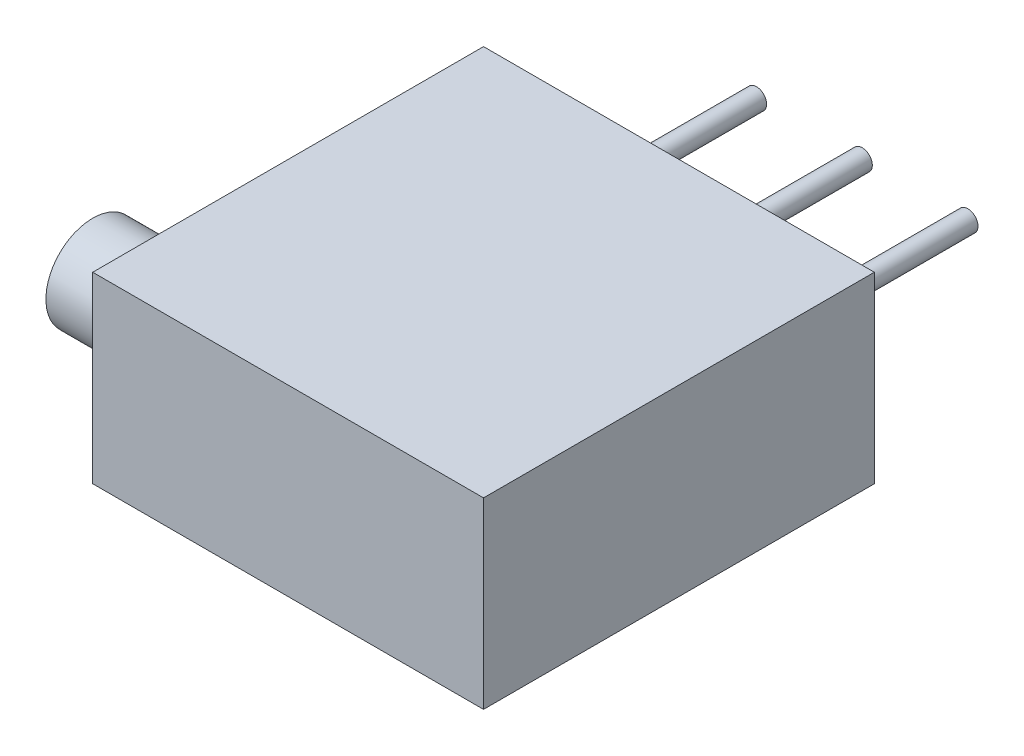
ISO-10303-21;
HEADER;
FILE_DESCRIPTION(('STEP AP214'),'2;1');
FILE_NAME('part.step','',(''),(''),'','','');
FILE_SCHEMA(('AUTOMOTIVE_DESIGN { 1 0 10303 214 1 1 1 1 }'));
ENDSEC;
DATA;
#1=APPLICATION_CONTEXT('core data for automotive mechanical design processes');
#2=APPLICATION_PROTOCOL_DEFINITION('international standard','automotive_design',2000,#1);
#3=PRODUCT_CONTEXT('',#1,'mechanical');
#4=PRODUCT('Part','Part','',(#3));
#5=PRODUCT_RELATED_PRODUCT_CATEGORY('part','',(#4));
#6=PRODUCT_DEFINITION_FORMATION('','',#4);
#7=PRODUCT_DEFINITION_CONTEXT('part definition',#1,'design');
#8=PRODUCT_DEFINITION('design','',#6,#7);
#9=PRODUCT_DEFINITION_SHAPE('','',#8);
#10=(LENGTH_UNIT() NAMED_UNIT(*) SI_UNIT(.MILLI.,.METRE.));
#11=(NAMED_UNIT(*) PLANE_ANGLE_UNIT() SI_UNIT($,.RADIAN.));
#12=(NAMED_UNIT(*) SI_UNIT($,.STERADIAN.) SOLID_ANGLE_UNIT());
#13=UNCERTAINTY_MEASURE_WITH_UNIT(LENGTH_MEASURE(1.E-05),#10,'distance_accuracy_value','');
#14=(GEOMETRIC_REPRESENTATION_CONTEXT(3) GLOBAL_UNCERTAINTY_ASSIGNED_CONTEXT((#13)) GLOBAL_UNIT_ASSIGNED_CONTEXT((#10,
#11,#12)) REPRESENTATION_CONTEXT('',''));
#15=CARTESIAN_POINT('',(0.,0.,0.));
#16=DIRECTION('',(0.,0.,1.));
#17=DIRECTION('',(1.,0.,0.));
#18=AXIS2_PLACEMENT_3D('',#15,#16,#17);
#19=CARTESIAN_POINT('',(-4.79999999999999,4.5,-4.80000000000001));
#20=DIRECTION('',(0.,0.,1.));
#21=DIRECTION('',(1.,0.,0.));
#22=AXIS2_PLACEMENT_3D('',#19,#20,#21);
#23=PLANE('',#22);
#24=CARTESIAN_POINT('',(-2.59597838181529,2.25,-4.80000000000001));
#25=DIRECTION('',(0.,0.,1.));
#26=DIRECTION('',(1.,0.,0.));
#27=AXIS2_PLACEMENT_3D('',#24,#25,#26);
#28=CIRCLE('',#27,0.25);
#29=CARTESIAN_POINT('',(-2.34597838181529,2.25,-4.80000000000001));
#30=VERTEX_POINT('',#29);
#31=EDGE_CURVE('E43',#30,#30,#28,.F.);
#32=ORIENTED_EDGE('',*,*,#31,.F.);
#33=EDGE_LOOP('',(#32));
#34=FACE_BOUND('',#33,.T.);
#35=DIRECTION('',(-1.,0.,0.));
#36=VECTOR('',#35,1.);
#37=CARTESIAN_POINT('',(-4.79999999999999,0.,-4.80000000000001));
#38=LINE('',#37,#36);
#39=CARTESIAN_POINT('',(4.80000000000001,0.,-4.80000000000001));
#40=VERTEX_POINT('',#39);
#41=CARTESIAN_POINT('',(-4.79999999999999,0.,-4.80000000000001));
#42=VERTEX_POINT('',#41);
#43=EDGE_CURVE('E106',#40,#42,#38,.T.);
#44=ORIENTED_EDGE('',*,*,#43,.T.);
#45=DIRECTION('',(0.,-1.,0.));
#46=VECTOR('',#45,1.);
#47=CARTESIAN_POINT('',(-4.79999999999999,4.5,-4.80000000000001));
#48=LINE('',#47,#46);
#49=CARTESIAN_POINT('',(-4.79999999999999,4.5,-4.80000000000001));
#50=VERTEX_POINT('',#49);
#51=EDGE_CURVE('E97',#50,#42,#48,.T.);
#52=ORIENTED_EDGE('',*,*,#51,.F.);
#53=DIRECTION('',(-1.,0.,0.));
#54=VECTOR('',#53,1.);
#55=CARTESIAN_POINT('',(-4.79999999999999,4.5,-4.80000000000001));
#56=LINE('',#55,#54);
#57=CARTESIAN_POINT('',(4.80000000000001,4.5,-4.80000000000001));
#58=VERTEX_POINT('',#57);
#59=EDGE_CURVE('E50',#58,#50,#56,.T.);
#60=ORIENTED_EDGE('',*,*,#59,.F.);
#61=DIRECTION('',(0.,-1.,0.));
#62=VECTOR('',#61,1.);
#63=CARTESIAN_POINT('',(4.80000000000001,4.5,-4.80000000000001));
#64=LINE('',#63,#62);
#65=EDGE_CURVE('E114',#58,#40,#64,.T.);
#66=ORIENTED_EDGE('',*,*,#65,.T.);
#67=EDGE_LOOP('',(#44,#52,#60,#66));
#68=FACE_BOUND('',#67,.T.);
#69=CARTESIAN_POINT('',(0.,2.25,-4.80000000000001));
#70=DIRECTION('',(0.,0.,1.));
#71=DIRECTION('',(1.,0.,0.));
#72=AXIS2_PLACEMENT_3D('',#69,#70,#71);
#73=CIRCLE('',#72,0.25);
#74=CARTESIAN_POINT('',(0.250000000000008,2.25,-4.80000000000001));
#75=VERTEX_POINT('',#74);
#76=EDGE_CURVE('E93',#75,#75,#73,.F.);
#77=ORIENTED_EDGE('',*,*,#76,.F.);
#78=EDGE_LOOP('',(#77));
#79=FACE_BOUND('',#78,.T.);
#80=CARTESIAN_POINT('',(2.5959783818153,2.25,-4.80000000000001));
#81=DIRECTION('',(0.,0.,1.));
#82=DIRECTION('',(1.,0.,0.));
#83=AXIS2_PLACEMENT_3D('',#80,#81,#82);
#84=CIRCLE('',#83,0.25);
#85=CARTESIAN_POINT('',(2.8459783818153,2.25,-4.80000000000001));
#86=VERTEX_POINT('',#85);
#87=EDGE_CURVE('E11',#86,#86,#84,.F.);
#88=ORIENTED_EDGE('',*,*,#87,.F.);
#89=EDGE_LOOP('',(#88));
#90=FACE_BOUND('',#89,.T.);
#91=ADVANCED_FACE('F35',(#34,#68,#79,#90),#23,.F.);
#92=CARTESIAN_POINT('',(-4.79999999999999,4.5,-4.80000000000001));
#93=DIRECTION('',(1.,0.,0.));
#94=DIRECTION('',(0.,0.,-1.));
#95=AXIS2_PLACEMENT_3D('',#92,#93,#94);
#96=PLANE('',#95);
#97=CARTESIAN_POINT('',(-4.79999999999999,3.,3.29999999999999));
#98=DIRECTION('',(1.,0.,0.));
#99=DIRECTION('',(0.,0.,-1.));
#100=AXIS2_PLACEMENT_3D('',#97,#98,#99);
#101=CIRCLE('',#100,1.15);
#102=CARTESIAN_POINT('',(-4.79999999999999,3.,2.14999999999999));
#103=VERTEX_POINT('',#102);
#104=EDGE_CURVE('E178',#103,#103,#101,.T.);
#105=ORIENTED_EDGE('',*,*,#104,.T.);
#106=EDGE_LOOP('',(#105));
#107=FACE_BOUND('',#106,.T.);
#108=DIRECTION('',(0.,0.,1.));
#109=VECTOR('',#108,1.);
#110=CARTESIAN_POINT('',(-4.79999999999999,0.,-4.80000000000001));
#111=LINE('',#110,#109);
#112=CARTESIAN_POINT('',(-4.79999999999999,0.,4.79999999999999));
#113=VERTEX_POINT('',#112);
#114=EDGE_CURVE('E81',#42,#113,#111,.T.);
#115=ORIENTED_EDGE('',*,*,#114,.T.);
#116=DIRECTION('',(0.,-1.,0.));
#117=VECTOR('',#116,1.);
#118=CARTESIAN_POINT('',(-4.79999999999999,4.5,4.79999999999999));
#119=LINE('',#118,#117);
#120=CARTESIAN_POINT('',(-4.79999999999999,4.5,4.79999999999999));
#121=VERTEX_POINT('',#120);
#122=EDGE_CURVE('E88',#121,#113,#119,.T.);
#123=ORIENTED_EDGE('',*,*,#122,.F.);
#124=DIRECTION('',(0.,0.,1.));
#125=VECTOR('',#124,1.);
#126=CARTESIAN_POINT('',(-4.79999999999999,4.5,-4.80000000000001));
#127=LINE('',#126,#125);
#128=EDGE_CURVE('E108',#50,#121,#127,.T.);
#129=ORIENTED_EDGE('',*,*,#128,.F.);
#130=ORIENTED_EDGE('',*,*,#51,.T.);
#131=EDGE_LOOP('',(#115,#123,#129,#130));
#132=FACE_BOUND('',#131,.T.);
#133=ADVANCED_FACE('F37',(#107,#132),#96,.F.);
#134=CARTESIAN_POINT('',(-4.79999999999999,4.5,4.79999999999999));
#135=DIRECTION('',(0.,0.,-1.));
#136=DIRECTION('',(-1.,0.,0.));
#137=AXIS2_PLACEMENT_3D('',#134,#135,#136);
#138=PLANE('',#137);
#139=DIRECTION('',(1.,0.,0.));
#140=VECTOR('',#139,1.);
#141=CARTESIAN_POINT('',(-4.79999999999999,0.,4.79999999999999));
#142=LINE('',#141,#140);
#143=CARTESIAN_POINT('',(4.80000000000001,0.,4.79999999999999));
#144=VERTEX_POINT('',#143);
#145=EDGE_CURVE('E76',#113,#144,#142,.T.);
#146=ORIENTED_EDGE('',*,*,#145,.T.);
#147=DIRECTION('',(0.,-1.,0.));
#148=VECTOR('',#147,1.);
#149=CARTESIAN_POINT('',(4.80000000000001,4.5,4.79999999999999));
#150=LINE('',#149,#148);
#151=CARTESIAN_POINT('',(4.80000000000001,4.5,4.79999999999999));
#152=VERTEX_POINT('',#151);
#153=EDGE_CURVE('E94',#152,#144,#150,.T.);
#154=ORIENTED_EDGE('',*,*,#153,.F.);
#155=DIRECTION('',(1.,0.,0.));
#156=VECTOR('',#155,1.);
#157=CARTESIAN_POINT('',(-4.79999999999999,4.5,4.79999999999999));
#158=LINE('',#157,#156);
#159=EDGE_CURVE('E90',#121,#152,#158,.T.);
#160=ORIENTED_EDGE('',*,*,#159,.F.);
#161=ORIENTED_EDGE('',*,*,#122,.T.);
#162=EDGE_LOOP('',(#146,#154,#160,#161));
#163=FACE_BOUND('',#162,.T.);
#164=ADVANCED_FACE('F89',(#163),#138,.F.);
#165=CARTESIAN_POINT('',(4.80000000000001,4.5,-4.80000000000001));
#166=DIRECTION('',(-1.,0.,0.));
#167=DIRECTION('',(0.,0.,1.));
#168=AXIS2_PLACEMENT_3D('',#165,#166,#167);
#169=PLANE('',#168);
#170=DIRECTION('',(0.,0.,-1.));
#171=VECTOR('',#170,1.);
#172=CARTESIAN_POINT('',(4.80000000000001,0.,-4.80000000000001));
#173=LINE('',#172,#171);
#174=EDGE_CURVE('E82',#144,#40,#173,.T.);
#175=ORIENTED_EDGE('',*,*,#174,.T.);
#176=ORIENTED_EDGE('',*,*,#65,.F.);
#177=DIRECTION('',(0.,0.,-1.));
#178=VECTOR('',#177,1.);
#179=CARTESIAN_POINT('',(4.80000000000001,4.5,-4.80000000000001));
#180=LINE('',#179,#178);
#181=EDGE_CURVE('E55',#152,#58,#180,.T.);
#182=ORIENTED_EDGE('',*,*,#181,.F.);
#183=ORIENTED_EDGE('',*,*,#153,.T.);
#184=EDGE_LOOP('',(#175,#176,#182,#183));
#185=FACE_BOUND('',#184,.T.);
#186=ADVANCED_FACE('F165',(#185),#169,.F.);
#187=CARTESIAN_POINT('',(-4.79999999999999,4.5,-4.80000000000001));
#188=DIRECTION('',(0.,1.,0.));
#189=DIRECTION('',(0.,0.,1.));
#190=AXIS2_PLACEMENT_3D('',#187,#188,#189);
#191=PLANE('',#190);
#192=ORIENTED_EDGE('',*,*,#128,.T.);
#193=ORIENTED_EDGE('',*,*,#159,.T.);
#194=ORIENTED_EDGE('',*,*,#181,.T.);
#195=ORIENTED_EDGE('',*,*,#59,.T.);
#196=EDGE_LOOP('',(#192,#193,#194,#195));
#197=FACE_BOUND('',#196,.T.);
#198=ADVANCED_FACE('F163',(#197),#191,.T.);
#199=CARTESIAN_POINT('',(-4.79999999999999,0.,-4.80000000000001));
#200=DIRECTION('',(0.,1.,0.));
#201=DIRECTION('',(0.,0.,1.));
#202=AXIS2_PLACEMENT_3D('',#199,#200,#201);
#203=PLANE('',#202);
#204=ORIENTED_EDGE('',*,*,#114,.F.);
#205=ORIENTED_EDGE('',*,*,#43,.F.);
#206=ORIENTED_EDGE('',*,*,#174,.F.);
#207=ORIENTED_EDGE('',*,*,#145,.F.);
#208=EDGE_LOOP('',(#204,#205,#206,#207));
#209=FACE_BOUND('',#208,.T.);
#210=ADVANCED_FACE('F78',(#209),#203,.F.);
#211=CARTESIAN_POINT('',(0.,2.25,-9.3));
#212=DIRECTION('',(0.,0.,1.));
#213=DIRECTION('',(1.,0.,0.));
#214=AXIS2_PLACEMENT_3D('',#211,#212,#213);
#215=CYLINDRICAL_SURFACE('',#214,0.25);
#216=CARTESIAN_POINT('',(0.,2.25,-9.3));
#217=DIRECTION('',(0.,0.,-1.));
#218=DIRECTION('',(-1.,0.,0.));
#219=AXIS2_PLACEMENT_3D('',#216,#217,#218);
#220=CIRCLE('',#219,0.25);
#221=CARTESIAN_POINT('',(-0.249999999999992,2.25,-9.3));
#222=VERTEX_POINT('',#221);
#223=EDGE_CURVE('E98',#222,#222,#220,.T.);
#224=ORIENTED_EDGE('',*,*,#223,.F.);
#225=EDGE_LOOP('',(#224));
#226=FACE_BOUND('',#225,.T.);
#227=ORIENTED_EDGE('',*,*,#76,.T.);
#228=EDGE_LOOP('',(#227));
#229=FACE_BOUND('',#228,.T.);
#230=ADVANCED_FACE('F156',(#226,#229),#215,.T.);
#231=CARTESIAN_POINT('',(0.,2.25,-9.3));
#232=DIRECTION('',(0.,0.,-1.));
#233=DIRECTION('',(-1.,0.,0.));
#234=AXIS2_PLACEMENT_3D('',#231,#232,#233);
#235=PLANE('',#234);
#236=ORIENTED_EDGE('',*,*,#223,.T.);
#237=EDGE_LOOP('',(#236));
#238=FACE_BOUND('',#237,.T.);
#239=ADVANCED_FACE('F152',(#238),#235,.T.);
#240=CARTESIAN_POINT('',(-2.59597838181529,2.25,-9.3));
#241=DIRECTION('',(0.,0.,1.));
#242=DIRECTION('',(1.,0.,0.));
#243=AXIS2_PLACEMENT_3D('',#240,#241,#242);
#244=CYLINDRICAL_SURFACE('',#243,0.25);
#245=CARTESIAN_POINT('',(-2.59597838181529,2.25,-9.3));
#246=DIRECTION('',(0.,0.,-1.));
#247=DIRECTION('',(-1.,0.,0.));
#248=AXIS2_PLACEMENT_3D('',#245,#246,#247);
#249=CIRCLE('',#248,0.25);
#250=CARTESIAN_POINT('',(-2.84597838181529,2.25,-9.3));
#251=VERTEX_POINT('',#250);
#252=EDGE_CURVE('E101',#251,#251,#249,.T.);
#253=ORIENTED_EDGE('',*,*,#252,.F.);
#254=EDGE_LOOP('',(#253));
#255=FACE_BOUND('',#254,.T.);
#256=ORIENTED_EDGE('',*,*,#31,.T.);
#257=EDGE_LOOP('',(#256));
#258=FACE_BOUND('',#257,.T.);
#259=ADVANCED_FACE('F122',(#255,#258),#244,.T.);
#260=CARTESIAN_POINT('',(-2.59597838181529,2.25,-9.3));
#261=DIRECTION('',(0.,0.,-1.));
#262=DIRECTION('',(-1.,0.,0.));
#263=AXIS2_PLACEMENT_3D('',#260,#261,#262);
#264=PLANE('',#263);
#265=ORIENTED_EDGE('',*,*,#252,.T.);
#266=EDGE_LOOP('',(#265));
#267=FACE_BOUND('',#266,.T.);
#268=ADVANCED_FACE('F135',(#267),#264,.T.);
#269=CARTESIAN_POINT('',(2.5959783818153,2.25,-9.3));
#270=DIRECTION('',(0.,0.,1.));
#271=DIRECTION('',(1.,0.,0.));
#272=AXIS2_PLACEMENT_3D('',#269,#270,#271);
#273=CYLINDRICAL_SURFACE('',#272,0.25);
#274=CARTESIAN_POINT('',(2.5959783818153,2.25,-9.3));
#275=DIRECTION('',(0.,0.,-1.));
#276=DIRECTION('',(1.,0.,0.));
#277=AXIS2_PLACEMENT_3D('',#274,#275,#276);
#278=CIRCLE('',#277,0.25);
#279=CARTESIAN_POINT('',(2.8459783818153,2.25,-9.3));
#280=VERTEX_POINT('',#279);
#281=EDGE_CURVE('E183',#280,#280,#278,.T.);
#282=ORIENTED_EDGE('',*,*,#281,.F.);
#283=EDGE_LOOP('',(#282));
#284=FACE_BOUND('',#283,.T.);
#285=ORIENTED_EDGE('',*,*,#87,.T.);
#286=EDGE_LOOP('',(#285));
#287=FACE_BOUND('',#286,.T.);
#288=ADVANCED_FACE('F132',(#284,#287),#273,.T.);
#289=CARTESIAN_POINT('',(2.5959783818153,2.25,-9.3));
#290=DIRECTION('',(0.,0.,1.));
#291=DIRECTION('',(1.,0.,0.));
#292=AXIS2_PLACEMENT_3D('',#289,#290,#291);
#293=PLANE('',#292);
#294=ORIENTED_EDGE('',*,*,#281,.T.);
#295=EDGE_LOOP('',(#294));
#296=FACE_BOUND('',#295,.T.);
#297=ADVANCED_FACE('F134',(#296),#293,.F.);
#298=CARTESIAN_POINT('',(-6.29999999999999,3.,3.29999999999999));
#299=DIRECTION('',(1.,0.,0.));
#300=DIRECTION('',(0.,0.,-1.));
#301=AXIS2_PLACEMENT_3D('',#298,#299,#300);
#302=CYLINDRICAL_SURFACE('',#301,1.15);
#303=CARTESIAN_POINT('',(-6.29999999999999,3.,3.29999999999999));
#304=DIRECTION('',(1.,0.,0.));
#305=DIRECTION('',(0.,0.,-1.));
#306=AXIS2_PLACEMENT_3D('',#303,#304,#305);
#307=CIRCLE('',#306,1.15);
#308=CARTESIAN_POINT('',(-6.29999999999999,3.,2.14999999999999));
#309=VERTEX_POINT('',#308);
#310=EDGE_CURVE('E180',#309,#309,#307,.T.);
#311=ORIENTED_EDGE('',*,*,#310,.T.);
#312=EDGE_LOOP('',(#311));
#313=FACE_BOUND('',#312,.T.);
#314=ORIENTED_EDGE('',*,*,#104,.F.);
#315=EDGE_LOOP('',(#314));
#316=FACE_BOUND('',#315,.T.);
#317=ADVANCED_FACE('F142',(#313,#316),#302,.T.);
#318=CARTESIAN_POINT('',(-6.29999999999999,3.,3.29999999999999));
#319=DIRECTION('',(1.,0.,0.));
#320=DIRECTION('',(0.,0.,-1.));
#321=AXIS2_PLACEMENT_3D('',#318,#319,#320);
#322=PLANE('',#321);
#323=ORIENTED_EDGE('',*,*,#310,.F.);
#324=EDGE_LOOP('',(#323));
#325=FACE_BOUND('',#324,.T.);
#326=ADVANCED_FACE('F192',(#325),#322,.F.);
#327=CLOSED_SHELL('',(#91,#133,#164,#186,#198,#210,#230,#239,#259,#268,#288,#297,#317,#326));
#328=MANIFOLD_SOLID_BREP('B2',#327);
#329=ADVANCED_BREP_SHAPE_REPRESENTATION('',(#18,#328),#14);
#330=SHAPE_DEFINITION_REPRESENTATION(#9,#329);
ENDSEC;
END-ISO-10303-21;
